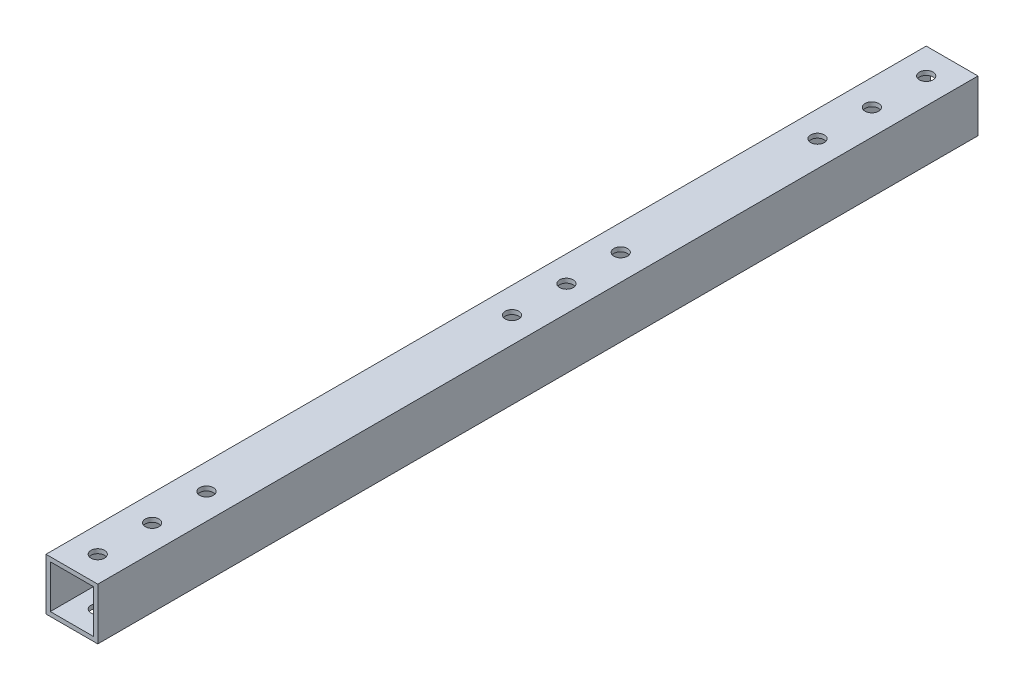
ISO-10303-21;
HEADER;
FILE_DESCRIPTION(('STEP AP214'),'2;1');
FILE_NAME('part.step','',(''),(''),'','','');
FILE_SCHEMA(('AUTOMOTIVE_DESIGN { 1 0 10303 214 1 1 1 1 }'));
ENDSEC;
DATA;
#1=APPLICATION_CONTEXT('core data for automotive mechanical design processes');
#2=APPLICATION_PROTOCOL_DEFINITION('international standard','automotive_design',2000,#1);
#3=PRODUCT_CONTEXT('',#1,'mechanical');
#4=PRODUCT('Part','Part','',(#3));
#5=PRODUCT_RELATED_PRODUCT_CATEGORY('part','',(#4));
#6=PRODUCT_DEFINITION_FORMATION('','',#4);
#7=PRODUCT_DEFINITION_CONTEXT('part definition',#1,'design');
#8=PRODUCT_DEFINITION('design','',#6,#7);
#9=PRODUCT_DEFINITION_SHAPE('','',#8);
#10=(LENGTH_UNIT() NAMED_UNIT(*) SI_UNIT(.MILLI.,.METRE.));
#11=(NAMED_UNIT(*) PLANE_ANGLE_UNIT() SI_UNIT($,.RADIAN.));
#12=(NAMED_UNIT(*) SI_UNIT($,.STERADIAN.) SOLID_ANGLE_UNIT());
#13=UNCERTAINTY_MEASURE_WITH_UNIT(LENGTH_MEASURE(1.E-05),#10,'distance_accuracy_value','');
#14=(GEOMETRIC_REPRESENTATION_CONTEXT(3) GLOBAL_UNCERTAINTY_ASSIGNED_CONTEXT((#13)) GLOBAL_UNIT_ASSIGNED_CONTEXT((#10,
#11,#12)) REPRESENTATION_CONTEXT('',''));
#15=CARTESIAN_POINT('',(0.,0.,0.));
#16=DIRECTION('',(0.,0.,1.));
#17=DIRECTION('',(1.,0.,0.));
#18=AXIS2_PLACEMENT_3D('',#15,#16,#17);
#19=CARTESIAN_POINT('',(0.,0.,161.925));
#20=DIRECTION('',(0.,0.,-1.));
#21=DIRECTION('',(-1.,0.,0.));
#22=AXIS2_PLACEMENT_3D('',#19,#20,#21);
#23=PLANE('',#22);
#24=DIRECTION('',(0.,1.,0.));
#25=VECTOR('',#24,1.);
#26=CARTESIAN_POINT('',(9.525,-9.525,161.925));
#27=LINE('',#26,#25);
#28=CARTESIAN_POINT('',(9.525,-9.525,161.925));
#29=VERTEX_POINT('',#28);
#30=CARTESIAN_POINT('',(9.525,9.525,161.925));
#31=VERTEX_POINT('',#30);
#32=EDGE_CURVE('E137',#29,#31,#27,.T.);
#33=ORIENTED_EDGE('',*,*,#32,.T.);
#34=DIRECTION('',(-1.,0.,0.));
#35=VECTOR('',#34,1.);
#36=CARTESIAN_POINT('',(-9.525,9.525,161.925));
#37=LINE('',#36,#35);
#38=CARTESIAN_POINT('',(-9.525,9.525,161.925));
#39=VERTEX_POINT('',#38);
#40=EDGE_CURVE('E140',#31,#39,#37,.T.);
#41=ORIENTED_EDGE('',*,*,#40,.T.);
#42=DIRECTION('',(0.,-1.,0.));
#43=VECTOR('',#42,1.);
#44=CARTESIAN_POINT('',(-9.525,-9.525,161.925));
#45=LINE('',#44,#43);
#46=CARTESIAN_POINT('',(-9.525,-9.525,161.925));
#47=VERTEX_POINT('',#46);
#48=EDGE_CURVE('E143',#39,#47,#45,.T.);
#49=ORIENTED_EDGE('',*,*,#48,.T.);
#50=DIRECTION('',(1.,0.,0.));
#51=VECTOR('',#50,1.);
#52=CARTESIAN_POINT('',(-9.525,-9.525,161.925));
#53=LINE('',#52,#51);
#54=EDGE_CURVE('E145',#47,#29,#53,.T.);
#55=ORIENTED_EDGE('',*,*,#54,.T.);
#56=EDGE_LOOP('',(#33,#41,#49,#55));
#57=FACE_BOUND('',#56,.T.);
#58=DIRECTION('',(0.,1.,0.));
#59=VECTOR('',#58,1.);
#60=CARTESIAN_POINT('',(7.9375,-7.9375,161.925));
#61=LINE('',#60,#59);
#62=CARTESIAN_POINT('',(7.9375,-7.9375,161.925));
#63=VERTEX_POINT('',#62);
#64=CARTESIAN_POINT('',(7.9375,7.9375,161.925));
#65=VERTEX_POINT('',#64);
#66=EDGE_CURVE('E99',#63,#65,#61,.T.);
#67=ORIENTED_EDGE('',*,*,#66,.F.);
#68=DIRECTION('',(1.,0.,0.));
#69=VECTOR('',#68,1.);
#70=CARTESIAN_POINT('',(-7.9375,-7.9375,161.925));
#71=LINE('',#70,#69);
#72=CARTESIAN_POINT('',(-7.9375,-7.9375,161.925));
#73=VERTEX_POINT('',#72);
#74=EDGE_CURVE('E121',#73,#63,#71,.T.);
#75=ORIENTED_EDGE('',*,*,#74,.F.);
#76=DIRECTION('',(0.,-1.,0.));
#77=VECTOR('',#76,1.);
#78=CARTESIAN_POINT('',(-7.9375,-7.9375,161.925));
#79=LINE('',#78,#77);
#80=CARTESIAN_POINT('',(-7.9375,7.9375,161.925));
#81=VERTEX_POINT('',#80);
#82=EDGE_CURVE('E119',#81,#73,#79,.T.);
#83=ORIENTED_EDGE('',*,*,#82,.F.);
#84=DIRECTION('',(-1.,0.,0.));
#85=VECTOR('',#84,1.);
#86=CARTESIAN_POINT('',(-7.9375,7.9375,161.925));
#87=LINE('',#86,#85);
#88=EDGE_CURVE('E107',#65,#81,#87,.T.);
#89=ORIENTED_EDGE('',*,*,#88,.F.);
#90=EDGE_LOOP('',(#67,#75,#83,#89));
#91=FACE_BOUND('',#90,.T.);
#92=ADVANCED_FACE('F32',(#57,#91),#23,.F.);
#93=CARTESIAN_POINT('',(0.,0.,-161.925));
#94=DIRECTION('',(0.,0.,-1.));
#95=DIRECTION('',(-1.,0.,0.));
#96=AXIS2_PLACEMENT_3D('',#93,#94,#95);
#97=PLANE('',#96);
#98=DIRECTION('',(0.,1.,0.));
#99=VECTOR('',#98,1.);
#100=CARTESIAN_POINT('',(9.525,-9.525,-161.925));
#101=LINE('',#100,#99);
#102=CARTESIAN_POINT('',(9.525,-9.525,-161.925));
#103=VERTEX_POINT('',#102);
#104=CARTESIAN_POINT('',(9.525,9.525,-161.925));
#105=VERTEX_POINT('',#104);
#106=EDGE_CURVE('E115',#103,#105,#101,.T.);
#107=ORIENTED_EDGE('',*,*,#106,.F.);
#108=DIRECTION('',(1.,0.,0.));
#109=VECTOR('',#108,1.);
#110=CARTESIAN_POINT('',(-9.525,-9.525,-161.925));
#111=LINE('',#110,#109);
#112=CARTESIAN_POINT('',(-9.525,-9.525,-161.925));
#113=VERTEX_POINT('',#112);
#114=EDGE_CURVE('E141',#113,#103,#111,.T.);
#115=ORIENTED_EDGE('',*,*,#114,.F.);
#116=DIRECTION('',(0.,-1.,0.));
#117=VECTOR('',#116,1.);
#118=CARTESIAN_POINT('',(-9.525,-9.525,-161.925));
#119=LINE('',#118,#117);
#120=CARTESIAN_POINT('',(-9.525,9.525,-161.925));
#121=VERTEX_POINT('',#120);
#122=EDGE_CURVE('E152',#121,#113,#119,.T.);
#123=ORIENTED_EDGE('',*,*,#122,.F.);
#124=DIRECTION('',(-1.,0.,0.));
#125=VECTOR('',#124,1.);
#126=CARTESIAN_POINT('',(-9.525,9.525,-161.925));
#127=LINE('',#126,#125);
#128=EDGE_CURVE('E150',#105,#121,#127,.T.);
#129=ORIENTED_EDGE('',*,*,#128,.F.);
#130=EDGE_LOOP('',(#107,#115,#123,#129));
#131=FACE_BOUND('',#130,.T.);
#132=DIRECTION('',(1.,0.,0.));
#133=VECTOR('',#132,1.);
#134=CARTESIAN_POINT('',(-7.9375,-7.9375,-161.925));
#135=LINE('',#134,#133);
#136=CARTESIAN_POINT('',(-7.9375,-7.9375,-161.925));
#137=VERTEX_POINT('',#136);
#138=CARTESIAN_POINT('',(7.9375,-7.9375,-161.925));
#139=VERTEX_POINT('',#138);
#140=EDGE_CURVE('E108',#137,#139,#135,.T.);
#141=ORIENTED_EDGE('',*,*,#140,.T.);
#142=DIRECTION('',(0.,1.,0.));
#143=VECTOR('',#142,1.);
#144=CARTESIAN_POINT('',(7.9375,-7.9375,-161.925));
#145=LINE('',#144,#143);
#146=CARTESIAN_POINT('',(7.9375,7.9375,-161.925));
#147=VERTEX_POINT('',#146);
#148=EDGE_CURVE('E57',#139,#147,#145,.T.);
#149=ORIENTED_EDGE('',*,*,#148,.T.);
#150=DIRECTION('',(-1.,0.,0.));
#151=VECTOR('',#150,1.);
#152=CARTESIAN_POINT('',(-7.9375,7.9375,-161.925));
#153=LINE('',#152,#151);
#154=CARTESIAN_POINT('',(-7.9375,7.9375,-161.925));
#155=VERTEX_POINT('',#154);
#156=EDGE_CURVE('E114',#147,#155,#153,.T.);
#157=ORIENTED_EDGE('',*,*,#156,.T.);
#158=DIRECTION('',(0.,-1.,0.));
#159=VECTOR('',#158,1.);
#160=CARTESIAN_POINT('',(-7.9375,-7.9375,-161.925));
#161=LINE('',#160,#159);
#162=EDGE_CURVE('E129',#155,#137,#161,.T.);
#163=ORIENTED_EDGE('',*,*,#162,.T.);
#164=EDGE_LOOP('',(#141,#149,#157,#163));
#165=FACE_BOUND('',#164,.T.);
#166=ADVANCED_FACE('F294',(#131,#165),#97,.T.);
#167=CARTESIAN_POINT('',(9.525,-9.525,161.925));
#168=DIRECTION('',(-1.,0.,0.));
#169=DIRECTION('',(0.,0.,1.));
#170=AXIS2_PLACEMENT_3D('',#167,#168,#169);
#171=PLANE('',#170);
#172=ORIENTED_EDGE('',*,*,#106,.T.);
#173=DIRECTION('',(0.,0.,-1.));
#174=VECTOR('',#173,1.);
#175=CARTESIAN_POINT('',(9.525,9.525,161.925));
#176=LINE('',#175,#174);
#177=EDGE_CURVE('E11',#31,#105,#176,.T.);
#178=ORIENTED_EDGE('',*,*,#177,.F.);
#179=ORIENTED_EDGE('',*,*,#32,.F.);
#180=DIRECTION('',(0.,0.,-1.));
#181=VECTOR('',#180,1.);
#182=CARTESIAN_POINT('',(9.525,-9.525,161.925));
#183=LINE('',#182,#181);
#184=EDGE_CURVE('E147',#29,#103,#183,.T.);
#185=ORIENTED_EDGE('',*,*,#184,.T.);
#186=EDGE_LOOP('',(#172,#178,#179,#185));
#187=FACE_BOUND('',#186,.T.);
#188=ADVANCED_FACE('F34',(#187),#171,.F.);
#189=CARTESIAN_POINT('',(-9.525,9.525,161.925));
#190=DIRECTION('',(0.,-1.,0.));
#191=DIRECTION('',(0.,0.,-1.));
#192=AXIS2_PLACEMENT_3D('',#189,#190,#191);
#193=PLANE('',#192);
#194=CARTESIAN_POINT('',(0.,9.525,-40.));
#195=DIRECTION('',(0.,-1.,0.));
#196=DIRECTION('',(0.,0.,-1.));
#197=AXIS2_PLACEMENT_3D('',#194,#195,#196);
#198=CIRCLE('',#197,2.50000000000002);
#199=CARTESIAN_POINT('',(0.,9.525,-42.5));
#200=VERTEX_POINT('',#199);
#201=EDGE_CURVE('E181',#200,#200,#198,.T.);
#202=ORIENTED_EDGE('',*,*,#201,.T.);
#203=EDGE_LOOP('',(#202));
#204=FACE_BOUND('',#203,.T.);
#205=CARTESIAN_POINT('',(0.,9.525,-20.));
#206=DIRECTION('',(0.,-1.,0.));
#207=DIRECTION('',(0.,0.,-1.));
#208=AXIS2_PLACEMENT_3D('',#205,#206,#207);
#209=CIRCLE('',#208,2.5);
#210=CARTESIAN_POINT('',(0.,9.525,-22.5));
#211=VERTEX_POINT('',#210);
#212=EDGE_CURVE('E215',#211,#211,#209,.T.);
#213=ORIENTED_EDGE('',*,*,#212,.T.);
#214=EDGE_LOOP('',(#213));
#215=FACE_BOUND('',#214,.T.);
#216=CARTESIAN_POINT('',(0.,9.525,0.));
#217=DIRECTION('',(0.,-1.,0.));
#218=DIRECTION('',(0.,0.,-1.));
#219=AXIS2_PLACEMENT_3D('',#216,#217,#218);
#220=CIRCLE('',#219,2.50000000000001);
#221=CARTESIAN_POINT('',(0.,9.525,-2.50000000000001));
#222=VERTEX_POINT('',#221);
#223=EDGE_CURVE('E198',#222,#222,#220,.T.);
#224=ORIENTED_EDGE('',*,*,#223,.T.);
#225=EDGE_LOOP('',(#224));
#226=FACE_BOUND('',#225,.T.);
#227=CARTESIAN_POINT('',(1.38777878078145E-13,9.525,112.4));
#228=DIRECTION('',(0.,-1.,0.));
#229=DIRECTION('',(0.,0.,-1.));
#230=AXIS2_PLACEMENT_3D('',#227,#228,#229);
#231=CIRCLE('',#230,2.5);
#232=CARTESIAN_POINT('',(1.38777878078145E-13,9.525,109.9));
#233=VERTEX_POINT('',#232);
#234=EDGE_CURVE('E166',#233,#233,#231,.F.);
#235=ORIENTED_EDGE('',*,*,#234,.F.);
#236=EDGE_LOOP('',(#235));
#237=FACE_BOUND('',#236,.T.);
#238=CARTESIAN_POINT('',(0.,9.525,132.4));
#239=DIRECTION('',(0.,-1.,0.));
#240=DIRECTION('',(0.,0.,-1.));
#241=AXIS2_PLACEMENT_3D('',#238,#239,#240);
#242=CIRCLE('',#241,2.5);
#243=CARTESIAN_POINT('',(0.,9.525,129.9));
#244=VERTEX_POINT('',#243);
#245=EDGE_CURVE('E191',#244,#244,#242,.F.);
#246=ORIENTED_EDGE('',*,*,#245,.F.);
#247=EDGE_LOOP('',(#246));
#248=FACE_BOUND('',#247,.T.);
#249=CARTESIAN_POINT('',(0.,9.525,152.4));
#250=DIRECTION('',(0.,-1.,0.));
#251=DIRECTION('',(0.,0.,-1.));
#252=AXIS2_PLACEMENT_3D('',#249,#250,#251);
#253=CIRCLE('',#252,2.50000000000002);
#254=CARTESIAN_POINT('',(0.,9.525,149.9));
#255=VERTEX_POINT('',#254);
#256=EDGE_CURVE('E186',#255,#255,#253,.F.);
#257=ORIENTED_EDGE('',*,*,#256,.F.);
#258=EDGE_LOOP('',(#257));
#259=FACE_BOUND('',#258,.T.);
#260=CARTESIAN_POINT('',(1.38777878078145E-13,9.525,-112.4));
#261=DIRECTION('',(0.,-1.,0.));
#262=DIRECTION('',(0.,0.,-1.));
#263=AXIS2_PLACEMENT_3D('',#260,#261,#262);
#264=CIRCLE('',#263,2.5);
#265=CARTESIAN_POINT('',(1.38777878078145E-13,9.525,-114.9));
#266=VERTEX_POINT('',#265);
#267=EDGE_CURVE('E127',#266,#266,#264,.T.);
#268=ORIENTED_EDGE('',*,*,#267,.T.);
#269=EDGE_LOOP('',(#268));
#270=FACE_BOUND('',#269,.T.);
#271=CARTESIAN_POINT('',(0.,9.525,-132.4));
#272=DIRECTION('',(0.,-1.,0.));
#273=DIRECTION('',(0.,0.,-1.));
#274=AXIS2_PLACEMENT_3D('',#271,#272,#273);
#275=CIRCLE('',#274,2.5);
#276=CARTESIAN_POINT('',(0.,9.525,-134.9));
#277=VERTEX_POINT('',#276);
#278=EDGE_CURVE('E176',#277,#277,#275,.T.);
#279=ORIENTED_EDGE('',*,*,#278,.T.);
#280=EDGE_LOOP('',(#279));
#281=FACE_BOUND('',#280,.T.);
#282=CARTESIAN_POINT('',(0.,9.525,-152.4));
#283=DIRECTION('',(0.,-1.,0.));
#284=DIRECTION('',(0.,0.,-1.));
#285=AXIS2_PLACEMENT_3D('',#282,#283,#284);
#286=CIRCLE('',#285,2.50000000000002);
#287=CARTESIAN_POINT('',(0.,9.525,-154.9));
#288=VERTEX_POINT('',#287);
#289=EDGE_CURVE('E171',#288,#288,#286,.T.);
#290=ORIENTED_EDGE('',*,*,#289,.T.);
#291=EDGE_LOOP('',(#290));
#292=FACE_BOUND('',#291,.T.);
#293=ORIENTED_EDGE('',*,*,#128,.T.);
#294=DIRECTION('',(0.,0.,-1.));
#295=VECTOR('',#294,1.);
#296=CARTESIAN_POINT('',(-9.525,9.525,161.925));
#297=LINE('',#296,#295);
#298=EDGE_CURVE('E41',#39,#121,#297,.T.);
#299=ORIENTED_EDGE('',*,*,#298,.F.);
#300=ORIENTED_EDGE('',*,*,#40,.F.);
#301=ORIENTED_EDGE('',*,*,#177,.T.);
#302=EDGE_LOOP('',(#293,#299,#300,#301));
#303=FACE_BOUND('',#302,.T.);
#304=ADVANCED_FACE('F268',(#204,#215,#226,#237,#248,#259,#270,#281,#292,#303),#193,.F.);
#305=CARTESIAN_POINT('',(-9.525,-9.525,161.925));
#306=DIRECTION('',(1.,0.,0.));
#307=DIRECTION('',(0.,0.,-1.));
#308=AXIS2_PLACEMENT_3D('',#305,#306,#307);
#309=PLANE('',#308);
#310=ORIENTED_EDGE('',*,*,#122,.T.);
#311=DIRECTION('',(0.,0.,-1.));
#312=VECTOR('',#311,1.);
#313=CARTESIAN_POINT('',(-9.525,-9.525,161.925));
#314=LINE('',#313,#312);
#315=EDGE_CURVE('E157',#47,#113,#314,.T.);
#316=ORIENTED_EDGE('',*,*,#315,.F.);
#317=ORIENTED_EDGE('',*,*,#48,.F.);
#318=ORIENTED_EDGE('',*,*,#298,.T.);
#319=EDGE_LOOP('',(#310,#316,#317,#318));
#320=FACE_BOUND('',#319,.T.);
#321=ADVANCED_FACE('F308',(#320),#309,.F.);
#322=CARTESIAN_POINT('',(-9.525,-9.525,161.925));
#323=DIRECTION('',(0.,1.,0.));
#324=DIRECTION('',(0.,0.,1.));
#325=AXIS2_PLACEMENT_3D('',#322,#323,#324);
#326=PLANE('',#325);
#327=CARTESIAN_POINT('',(0.,-9.525,-40.));
#328=DIRECTION('',(0.,1.,0.));
#329=DIRECTION('',(0.,0.,1.));
#330=AXIS2_PLACEMENT_3D('',#327,#328,#329);
#331=CIRCLE('',#330,2.50000000000002);
#332=CARTESIAN_POINT('',(0.,-9.525,-37.5));
#333=VERTEX_POINT('',#332);
#334=EDGE_CURVE('E221',#333,#333,#331,.T.);
#335=ORIENTED_EDGE('',*,*,#334,.T.);
#336=EDGE_LOOP('',(#335));
#337=FACE_BOUND('',#336,.T.);
#338=CARTESIAN_POINT('',(0.,-9.525,-20.));
#339=DIRECTION('',(0.,1.,0.));
#340=DIRECTION('',(0.,0.,1.));
#341=AXIS2_PLACEMENT_3D('',#338,#339,#340);
#342=CIRCLE('',#341,2.5);
#343=CARTESIAN_POINT('',(0.,-9.525,-17.5));
#344=VERTEX_POINT('',#343);
#345=EDGE_CURVE('E202',#344,#344,#342,.T.);
#346=ORIENTED_EDGE('',*,*,#345,.T.);
#347=EDGE_LOOP('',(#346));
#348=FACE_BOUND('',#347,.T.);
#349=CARTESIAN_POINT('',(0.,-9.525,0.));
#350=DIRECTION('',(0.,1.,0.));
#351=DIRECTION('',(0.,0.,1.));
#352=AXIS2_PLACEMENT_3D('',#349,#350,#351);
#353=CIRCLE('',#352,2.50000000000001);
#354=CARTESIAN_POINT('',(0.,-9.525,2.50000000000001));
#355=VERTEX_POINT('',#354);
#356=EDGE_CURVE('E205',#355,#355,#353,.T.);
#357=ORIENTED_EDGE('',*,*,#356,.T.);
#358=EDGE_LOOP('',(#357));
#359=FACE_BOUND('',#358,.T.);
#360=CARTESIAN_POINT('',(1.38777878078145E-13,-9.525,112.4));
#361=DIRECTION('',(0.,1.,0.));
#362=DIRECTION('',(0.,0.,1.));
#363=AXIS2_PLACEMENT_3D('',#360,#361,#362);
#364=CIRCLE('',#363,2.5);
#365=CARTESIAN_POINT('',(1.38777878078145E-13,-9.525,114.9));
#366=VERTEX_POINT('',#365);
#367=EDGE_CURVE('E242',#366,#366,#364,.F.);
#368=ORIENTED_EDGE('',*,*,#367,.F.);
#369=EDGE_LOOP('',(#368));
#370=FACE_BOUND('',#369,.T.);
#371=CARTESIAN_POINT('',(0.,-9.525,132.4));
#372=DIRECTION('',(0.,1.,0.));
#373=DIRECTION('',(0.,0.,1.));
#374=AXIS2_PLACEMENT_3D('',#371,#372,#373);
#375=CIRCLE('',#374,2.5);
#376=CARTESIAN_POINT('',(0.,-9.525,134.9));
#377=VERTEX_POINT('',#376);
#378=EDGE_CURVE('E235',#377,#377,#375,.F.);
#379=ORIENTED_EDGE('',*,*,#378,.F.);
#380=EDGE_LOOP('',(#379));
#381=FACE_BOUND('',#380,.T.);
#382=CARTESIAN_POINT('',(0.,-9.525,152.4));
#383=DIRECTION('',(0.,1.,0.));
#384=DIRECTION('',(0.,0.,1.));
#385=AXIS2_PLACEMENT_3D('',#382,#383,#384);
#386=CIRCLE('',#385,2.50000000000002);
#387=CARTESIAN_POINT('',(0.,-9.525,154.9));
#388=VERTEX_POINT('',#387);
#389=EDGE_CURVE('E228',#388,#388,#386,.F.);
#390=ORIENTED_EDGE('',*,*,#389,.F.);
#391=EDGE_LOOP('',(#390));
#392=FACE_BOUND('',#391,.T.);
#393=CARTESIAN_POINT('',(1.38777878078145E-13,-9.525,-112.4));
#394=DIRECTION('',(0.,1.,0.));
#395=DIRECTION('',(0.,0.,1.));
#396=AXIS2_PLACEMENT_3D('',#393,#394,#395);
#397=CIRCLE('',#396,2.5);
#398=CARTESIAN_POINT('',(1.38777878078145E-13,-9.525,-109.9));
#399=VERTEX_POINT('',#398);
#400=EDGE_CURVE('E263',#399,#399,#397,.T.);
#401=ORIENTED_EDGE('',*,*,#400,.T.);
#402=EDGE_LOOP('',(#401));
#403=FACE_BOUND('',#402,.T.);
#404=CARTESIAN_POINT('',(0.,-9.525,-132.4));
#405=DIRECTION('',(0.,1.,0.));
#406=DIRECTION('',(0.,0.,1.));
#407=AXIS2_PLACEMENT_3D('',#404,#405,#406);
#408=CIRCLE('',#407,2.5);
#409=CARTESIAN_POINT('',(0.,-9.525,-129.9));
#410=VERTEX_POINT('',#409);
#411=EDGE_CURVE('E256',#410,#410,#408,.T.);
#412=ORIENTED_EDGE('',*,*,#411,.T.);
#413=EDGE_LOOP('',(#412));
#414=FACE_BOUND('',#413,.T.);
#415=CARTESIAN_POINT('',(0.,-9.525,-152.4));
#416=DIRECTION('',(0.,1.,0.));
#417=DIRECTION('',(0.,0.,1.));
#418=AXIS2_PLACEMENT_3D('',#415,#416,#417);
#419=CIRCLE('',#418,2.50000000000002);
#420=CARTESIAN_POINT('',(0.,-9.525,-149.9));
#421=VERTEX_POINT('',#420);
#422=EDGE_CURVE('E249',#421,#421,#419,.T.);
#423=ORIENTED_EDGE('',*,*,#422,.T.);
#424=EDGE_LOOP('',(#423));
#425=FACE_BOUND('',#424,.T.);
#426=ORIENTED_EDGE('',*,*,#114,.T.);
#427=ORIENTED_EDGE('',*,*,#184,.F.);
#428=ORIENTED_EDGE('',*,*,#54,.F.);
#429=ORIENTED_EDGE('',*,*,#315,.T.);
#430=EDGE_LOOP('',(#426,#427,#428,#429));
#431=FACE_BOUND('',#430,.T.);
#432=ADVANCED_FACE('F305',(#337,#348,#359,#370,#381,#392,#403,#414,#425,#431),#326,.F.);
#433=CARTESIAN_POINT('',(7.9375,-7.9375,161.925));
#434=DIRECTION('',(-1.,0.,0.));
#435=DIRECTION('',(0.,-1.,0.));
#436=AXIS2_PLACEMENT_3D('',#433,#434,#435);
#437=PLANE('',#436);
#438=ORIENTED_EDGE('',*,*,#148,.F.);
#439=DIRECTION('',(0.,0.,-1.));
#440=VECTOR('',#439,1.);
#441=CARTESIAN_POINT('',(7.9375,-7.9375,161.925));
#442=LINE('',#441,#440);
#443=EDGE_CURVE('E103',#63,#139,#442,.T.);
#444=ORIENTED_EDGE('',*,*,#443,.F.);
#445=ORIENTED_EDGE('',*,*,#66,.T.);
#446=DIRECTION('',(0.,0.,-1.));
#447=VECTOR('',#446,1.);
#448=CARTESIAN_POINT('',(7.9375,7.9375,161.925));
#449=LINE('',#448,#447);
#450=EDGE_CURVE('E102',#65,#147,#449,.T.);
#451=ORIENTED_EDGE('',*,*,#450,.T.);
#452=EDGE_LOOP('',(#438,#444,#445,#451));
#453=FACE_BOUND('',#452,.T.);
#454=ADVANCED_FACE('F101',(#453),#437,.T.);
#455=CARTESIAN_POINT('',(-7.9375,7.9375,161.925));
#456=DIRECTION('',(0.,-1.,0.));
#457=DIRECTION('',(0.,0.,-1.));
#458=AXIS2_PLACEMENT_3D('',#455,#456,#457);
#459=PLANE('',#458);
#460=CARTESIAN_POINT('',(0.,7.9375,-40.));
#461=DIRECTION('',(0.,-1.,0.));
#462=DIRECTION('',(0.,0.,-1.));
#463=AXIS2_PLACEMENT_3D('',#460,#461,#462);
#464=CIRCLE('',#463,2.50000000000002);
#465=CARTESIAN_POINT('',(0.,7.9375,-42.5));
#466=VERTEX_POINT('',#465);
#467=EDGE_CURVE('E218',#466,#466,#464,.T.);
#468=ORIENTED_EDGE('',*,*,#467,.F.);
#469=EDGE_LOOP('',(#468));
#470=FACE_BOUND('',#469,.T.);
#471=CARTESIAN_POINT('',(0.,7.9375,-20.));
#472=DIRECTION('',(0.,-1.,0.));
#473=DIRECTION('',(0.,0.,-1.));
#474=AXIS2_PLACEMENT_3D('',#471,#472,#473);
#475=CIRCLE('',#474,2.5);
#476=CARTESIAN_POINT('',(0.,7.9375,-22.5));
#477=VERTEX_POINT('',#476);
#478=EDGE_CURVE('E197',#477,#477,#475,.T.);
#479=ORIENTED_EDGE('',*,*,#478,.F.);
#480=EDGE_LOOP('',(#479));
#481=FACE_BOUND('',#480,.T.);
#482=CARTESIAN_POINT('',(0.,7.9375,0.));
#483=DIRECTION('',(0.,-1.,0.));
#484=DIRECTION('',(0.,0.,-1.));
#485=AXIS2_PLACEMENT_3D('',#482,#483,#484);
#486=CIRCLE('',#485,2.50000000000001);
#487=CARTESIAN_POINT('',(0.,7.9375,-2.50000000000001));
#488=VERTEX_POINT('',#487);
#489=EDGE_CURVE('E194',#488,#488,#486,.T.);
#490=ORIENTED_EDGE('',*,*,#489,.F.);
#491=EDGE_LOOP('',(#490));
#492=FACE_BOUND('',#491,.T.);
#493=CARTESIAN_POINT('',(1.38777878078145E-13,7.9375,112.4));
#494=DIRECTION('',(0.,-1.,0.));
#495=DIRECTION('',(0.,0.,-1.));
#496=AXIS2_PLACEMENT_3D('',#493,#494,#495);
#497=CIRCLE('',#496,2.5);
#498=CARTESIAN_POINT('',(1.38777878078145E-13,7.9375,109.9));
#499=VERTEX_POINT('',#498);
#500=EDGE_CURVE('E190',#499,#499,#497,.F.);
#501=ORIENTED_EDGE('',*,*,#500,.T.);
#502=EDGE_LOOP('',(#501));
#503=FACE_BOUND('',#502,.T.);
#504=CARTESIAN_POINT('',(0.,7.9375,132.4));
#505=DIRECTION('',(0.,-1.,0.));
#506=DIRECTION('',(0.,0.,-1.));
#507=AXIS2_PLACEMENT_3D('',#504,#505,#506);
#508=CIRCLE('',#507,2.5);
#509=CARTESIAN_POINT('',(0.,7.9375,129.9));
#510=VERTEX_POINT('',#509);
#511=EDGE_CURVE('E185',#510,#510,#508,.F.);
#512=ORIENTED_EDGE('',*,*,#511,.T.);
#513=EDGE_LOOP('',(#512));
#514=FACE_BOUND('',#513,.T.);
#515=CARTESIAN_POINT('',(0.,7.9375,152.4));
#516=DIRECTION('',(0.,-1.,0.));
#517=DIRECTION('',(0.,0.,-1.));
#518=AXIS2_PLACEMENT_3D('',#515,#516,#517);
#519=CIRCLE('',#518,2.50000000000002);
#520=CARTESIAN_POINT('',(0.,7.9375,149.9));
#521=VERTEX_POINT('',#520);
#522=EDGE_CURVE('E180',#521,#521,#519,.F.);
#523=ORIENTED_EDGE('',*,*,#522,.T.);
#524=EDGE_LOOP('',(#523));
#525=FACE_BOUND('',#524,.T.);
#526=CARTESIAN_POINT('',(1.38777878078145E-13,7.9375,-112.4));
#527=DIRECTION('',(0.,-1.,0.));
#528=DIRECTION('',(0.,0.,-1.));
#529=AXIS2_PLACEMENT_3D('',#526,#527,#528);
#530=CIRCLE('',#529,2.5);
#531=CARTESIAN_POINT('',(1.38777878078145E-13,7.9375,-114.9));
#532=VERTEX_POINT('',#531);
#533=EDGE_CURVE('E175',#532,#532,#530,.T.);
#534=ORIENTED_EDGE('',*,*,#533,.F.);
#535=EDGE_LOOP('',(#534));
#536=FACE_BOUND('',#535,.T.);
#537=CARTESIAN_POINT('',(0.,7.9375,-132.4));
#538=DIRECTION('',(0.,-1.,0.));
#539=DIRECTION('',(0.,0.,-1.));
#540=AXIS2_PLACEMENT_3D('',#537,#538,#539);
#541=CIRCLE('',#540,2.5);
#542=CARTESIAN_POINT('',(0.,7.9375,-134.9));
#543=VERTEX_POINT('',#542);
#544=EDGE_CURVE('E170',#543,#543,#541,.T.);
#545=ORIENTED_EDGE('',*,*,#544,.F.);
#546=EDGE_LOOP('',(#545));
#547=FACE_BOUND('',#546,.T.);
#548=CARTESIAN_POINT('',(0.,7.9375,-152.4));
#549=DIRECTION('',(0.,-1.,0.));
#550=DIRECTION('',(0.,0.,-1.));
#551=AXIS2_PLACEMENT_3D('',#548,#549,#550);
#552=CIRCLE('',#551,2.50000000000002);
#553=CARTESIAN_POINT('',(0.,7.9375,-154.9));
#554=VERTEX_POINT('',#553);
#555=EDGE_CURVE('E165',#554,#554,#552,.T.);
#556=ORIENTED_EDGE('',*,*,#555,.F.);
#557=EDGE_LOOP('',(#556));
#558=FACE_BOUND('',#557,.T.);
#559=ORIENTED_EDGE('',*,*,#156,.F.);
#560=ORIENTED_EDGE('',*,*,#450,.F.);
#561=ORIENTED_EDGE('',*,*,#88,.T.);
#562=DIRECTION('',(0.,0.,-1.));
#563=VECTOR('',#562,1.);
#564=CARTESIAN_POINT('',(-7.9375,7.9375,161.925));
#565=LINE('',#564,#563);
#566=EDGE_CURVE('E116',#81,#155,#565,.T.);
#567=ORIENTED_EDGE('',*,*,#566,.T.);
#568=EDGE_LOOP('',(#559,#560,#561,#567));
#569=FACE_BOUND('',#568,.T.);
#570=ADVANCED_FACE('F111',(#470,#481,#492,#503,#514,#525,#536,#547,#558,#569),#459,.T.);
#571=CARTESIAN_POINT('',(-7.9375,-7.9375,161.925));
#572=DIRECTION('',(1.,0.,0.));
#573=DIRECTION('',(0.,0.,-1.));
#574=AXIS2_PLACEMENT_3D('',#571,#572,#573);
#575=PLANE('',#574);
#576=ORIENTED_EDGE('',*,*,#162,.F.);
#577=ORIENTED_EDGE('',*,*,#566,.F.);
#578=ORIENTED_EDGE('',*,*,#82,.T.);
#579=DIRECTION('',(0.,0.,-1.));
#580=VECTOR('',#579,1.);
#581=CARTESIAN_POINT('',(-7.9375,-7.9375,161.925));
#582=LINE('',#581,#580);
#583=EDGE_CURVE('E49',#73,#137,#582,.T.);
#584=ORIENTED_EDGE('',*,*,#583,.T.);
#585=EDGE_LOOP('',(#576,#577,#578,#584));
#586=FACE_BOUND('',#585,.T.);
#587=ADVANCED_FACE('F404',(#586),#575,.T.);
#588=CARTESIAN_POINT('',(-7.9375,-7.9375,161.925));
#589=DIRECTION('',(0.,1.,0.));
#590=DIRECTION('',(0.,0.,1.));
#591=AXIS2_PLACEMENT_3D('',#588,#589,#590);
#592=PLANE('',#591);
#593=CARTESIAN_POINT('',(0.,-7.9375,-40.));
#594=DIRECTION('',(0.,1.,0.));
#595=DIRECTION('',(0.,0.,1.));
#596=AXIS2_PLACEMENT_3D('',#593,#594,#595);
#597=CIRCLE('',#596,2.50000000000002);
#598=CARTESIAN_POINT('',(0.,-7.9375,-37.5));
#599=VERTEX_POINT('',#598);
#600=EDGE_CURVE('E36',#599,#599,#597,.T.);
#601=ORIENTED_EDGE('',*,*,#600,.F.);
#602=EDGE_LOOP('',(#601));
#603=FACE_BOUND('',#602,.T.);
#604=CARTESIAN_POINT('',(0.,-7.9375,-20.));
#605=DIRECTION('',(0.,1.,0.));
#606=DIRECTION('',(0.,0.,1.));
#607=AXIS2_PLACEMENT_3D('',#604,#605,#606);
#608=CIRCLE('',#607,2.5);
#609=CARTESIAN_POINT('',(0.,-7.9375,-17.5));
#610=VERTEX_POINT('',#609);
#611=EDGE_CURVE('E195',#610,#610,#608,.T.);
#612=ORIENTED_EDGE('',*,*,#611,.F.);
#613=EDGE_LOOP('',(#612));
#614=FACE_BOUND('',#613,.T.);
#615=CARTESIAN_POINT('',(0.,-7.9375,0.));
#616=DIRECTION('',(0.,1.,0.));
#617=DIRECTION('',(0.,0.,1.));
#618=AXIS2_PLACEMENT_3D('',#615,#616,#617);
#619=CIRCLE('',#618,2.50000000000001);
#620=CARTESIAN_POINT('',(0.,-7.9375,2.50000000000001));
#621=VERTEX_POINT('',#620);
#622=EDGE_CURVE('E192',#621,#621,#619,.T.);
#623=ORIENTED_EDGE('',*,*,#622,.F.);
#624=EDGE_LOOP('',(#623));
#625=FACE_BOUND('',#624,.T.);
#626=CARTESIAN_POINT('',(1.38777878078145E-13,-7.9375,112.4));
#627=DIRECTION('',(0.,1.,0.));
#628=DIRECTION('',(0.,0.,1.));
#629=AXIS2_PLACEMENT_3D('',#626,#627,#628);
#630=CIRCLE('',#629,2.5);
#631=CARTESIAN_POINT('',(1.38777878078145E-13,-7.9375,114.9));
#632=VERTEX_POINT('',#631);
#633=EDGE_CURVE('E187',#632,#632,#630,.F.);
#634=ORIENTED_EDGE('',*,*,#633,.T.);
#635=EDGE_LOOP('',(#634));
#636=FACE_BOUND('',#635,.T.);
#637=CARTESIAN_POINT('',(0.,-7.9375,132.4));
#638=DIRECTION('',(0.,1.,0.));
#639=DIRECTION('',(0.,0.,1.));
#640=AXIS2_PLACEMENT_3D('',#637,#638,#639);
#641=CIRCLE('',#640,2.5);
#642=CARTESIAN_POINT('',(0.,-7.9375,134.9));
#643=VERTEX_POINT('',#642);
#644=EDGE_CURVE('E182',#643,#643,#641,.F.);
#645=ORIENTED_EDGE('',*,*,#644,.T.);
#646=EDGE_LOOP('',(#645));
#647=FACE_BOUND('',#646,.T.);
#648=CARTESIAN_POINT('',(0.,-7.9375,152.4));
#649=DIRECTION('',(0.,1.,0.));
#650=DIRECTION('',(0.,0.,1.));
#651=AXIS2_PLACEMENT_3D('',#648,#649,#650);
#652=CIRCLE('',#651,2.50000000000002);
#653=CARTESIAN_POINT('',(0.,-7.9375,154.9));
#654=VERTEX_POINT('',#653);
#655=EDGE_CURVE('E177',#654,#654,#652,.F.);
#656=ORIENTED_EDGE('',*,*,#655,.T.);
#657=EDGE_LOOP('',(#656));
#658=FACE_BOUND('',#657,.T.);
#659=CARTESIAN_POINT('',(1.38777878078145E-13,-7.9375,-112.4));
#660=DIRECTION('',(0.,1.,0.));
#661=DIRECTION('',(0.,0.,1.));
#662=AXIS2_PLACEMENT_3D('',#659,#660,#661);
#663=CIRCLE('',#662,2.5);
#664=CARTESIAN_POINT('',(1.38777878078145E-13,-7.9375,-109.9));
#665=VERTEX_POINT('',#664);
#666=EDGE_CURVE('E172',#665,#665,#663,.T.);
#667=ORIENTED_EDGE('',*,*,#666,.F.);
#668=EDGE_LOOP('',(#667));
#669=FACE_BOUND('',#668,.T.);
#670=CARTESIAN_POINT('',(0.,-7.9375,-132.4));
#671=DIRECTION('',(0.,1.,0.));
#672=DIRECTION('',(0.,0.,1.));
#673=AXIS2_PLACEMENT_3D('',#670,#671,#672);
#674=CIRCLE('',#673,2.5);
#675=CARTESIAN_POINT('',(0.,-7.9375,-129.9));
#676=VERTEX_POINT('',#675);
#677=EDGE_CURVE('E167',#676,#676,#674,.T.);
#678=ORIENTED_EDGE('',*,*,#677,.F.);
#679=EDGE_LOOP('',(#678));
#680=FACE_BOUND('',#679,.T.);
#681=CARTESIAN_POINT('',(0.,-7.9375,-152.4));
#682=DIRECTION('',(0.,1.,0.));
#683=DIRECTION('',(0.,0.,1.));
#684=AXIS2_PLACEMENT_3D('',#681,#682,#683);
#685=CIRCLE('',#684,2.50000000000002);
#686=CARTESIAN_POINT('',(0.,-7.9375,-149.9));
#687=VERTEX_POINT('',#686);
#688=EDGE_CURVE('E162',#687,#687,#685,.T.);
#689=ORIENTED_EDGE('',*,*,#688,.F.);
#690=EDGE_LOOP('',(#689));
#691=FACE_BOUND('',#690,.T.);
#692=ORIENTED_EDGE('',*,*,#140,.F.);
#693=ORIENTED_EDGE('',*,*,#583,.F.);
#694=ORIENTED_EDGE('',*,*,#74,.T.);
#695=ORIENTED_EDGE('',*,*,#443,.T.);
#696=EDGE_LOOP('',(#692,#693,#694,#695));
#697=FACE_BOUND('',#696,.T.);
#698=ADVANCED_FACE('F401',(#603,#614,#625,#636,#647,#658,#669,#680,#691,#697),#592,.T.);
#699=CARTESIAN_POINT('',(0.,-16.475,-152.4));
#700=DIRECTION('',(0.,1.,0.));
#701=DIRECTION('',(0.,0.,1.));
#702=AXIS2_PLACEMENT_3D('',#699,#700,#701);
#703=CYLINDRICAL_SURFACE('',#702,2.50000000000002);
#704=ORIENTED_EDGE('',*,*,#688,.T.);
#705=EDGE_LOOP('',(#704));
#706=FACE_BOUND('',#705,.T.);
#707=ORIENTED_EDGE('',*,*,#422,.F.);
#708=EDGE_LOOP('',(#707));
#709=FACE_BOUND('',#708,.T.);
#710=ADVANCED_FACE('F403',(#706,#709),#703,.F.);
#711=CARTESIAN_POINT('',(0.,-16.475,-132.4));
#712=DIRECTION('',(0.,1.,0.));
#713=DIRECTION('',(0.,0.,1.));
#714=AXIS2_PLACEMENT_3D('',#711,#712,#713);
#715=CYLINDRICAL_SURFACE('',#714,2.5);
#716=ORIENTED_EDGE('',*,*,#677,.T.);
#717=EDGE_LOOP('',(#716));
#718=FACE_BOUND('',#717,.T.);
#719=ORIENTED_EDGE('',*,*,#411,.F.);
#720=EDGE_LOOP('',(#719));
#721=FACE_BOUND('',#720,.T.);
#722=ADVANCED_FACE('F289',(#718,#721),#715,.F.);
#723=CARTESIAN_POINT('',(1.38777878078145E-13,-16.475,-112.4));
#724=DIRECTION('',(0.,1.,0.));
#725=DIRECTION('',(0.,0.,1.));
#726=AXIS2_PLACEMENT_3D('',#723,#724,#725);
#727=CYLINDRICAL_SURFACE('',#726,2.5);
#728=ORIENTED_EDGE('',*,*,#666,.T.);
#729=EDGE_LOOP('',(#728));
#730=FACE_BOUND('',#729,.T.);
#731=ORIENTED_EDGE('',*,*,#400,.F.);
#732=EDGE_LOOP('',(#731));
#733=FACE_BOUND('',#732,.T.);
#734=ADVANCED_FACE('F277',(#730,#733),#727,.F.);
#735=ORIENTED_EDGE('',*,*,#555,.T.);
#736=EDGE_LOOP('',(#735));
#737=FACE_BOUND('',#736,.T.);
#738=ORIENTED_EDGE('',*,*,#289,.F.);
#739=EDGE_LOOP('',(#738));
#740=FACE_BOUND('',#739,.T.);
#741=ADVANCED_FACE('F286',(#737,#740),#703,.F.);
#742=ORIENTED_EDGE('',*,*,#544,.T.);
#743=EDGE_LOOP('',(#742));
#744=FACE_BOUND('',#743,.T.);
#745=ORIENTED_EDGE('',*,*,#278,.F.);
#746=EDGE_LOOP('',(#745));
#747=FACE_BOUND('',#746,.T.);
#748=ADVANCED_FACE('F274',(#744,#747),#715,.F.);
#749=ORIENTED_EDGE('',*,*,#533,.T.);
#750=EDGE_LOOP('',(#749));
#751=FACE_BOUND('',#750,.T.);
#752=ORIENTED_EDGE('',*,*,#267,.F.);
#753=EDGE_LOOP('',(#752));
#754=FACE_BOUND('',#753,.T.);
#755=ADVANCED_FACE('F271',(#751,#754),#727,.F.);
#756=CARTESIAN_POINT('',(0.,-16.475,152.4));
#757=DIRECTION('',(0.,1.,0.));
#758=DIRECTION('',(0.,0.,1.));
#759=AXIS2_PLACEMENT_3D('',#756,#757,#758);
#760=CYLINDRICAL_SURFACE('',#759,2.50000000000002);
#761=ORIENTED_EDGE('',*,*,#655,.F.);
#762=EDGE_LOOP('',(#761));
#763=FACE_BOUND('',#762,.T.);
#764=ORIENTED_EDGE('',*,*,#389,.T.);
#765=EDGE_LOOP('',(#764));
#766=FACE_BOUND('',#765,.T.);
#767=ADVANCED_FACE('F273',(#763,#766),#760,.F.);
#768=CARTESIAN_POINT('',(0.,-16.475,132.4));
#769=DIRECTION('',(0.,1.,0.));
#770=DIRECTION('',(0.,0.,1.));
#771=AXIS2_PLACEMENT_3D('',#768,#769,#770);
#772=CYLINDRICAL_SURFACE('',#771,2.5);
#773=ORIENTED_EDGE('',*,*,#644,.F.);
#774=EDGE_LOOP('',(#773));
#775=FACE_BOUND('',#774,.T.);
#776=ORIENTED_EDGE('',*,*,#378,.T.);
#777=EDGE_LOOP('',(#776));
#778=FACE_BOUND('',#777,.T.);
#779=ADVANCED_FACE('F282',(#775,#778),#772,.F.);
#780=CARTESIAN_POINT('',(1.38777878078145E-13,-16.475,112.4));
#781=DIRECTION('',(0.,1.,0.));
#782=DIRECTION('',(0.,0.,1.));
#783=AXIS2_PLACEMENT_3D('',#780,#781,#782);
#784=CYLINDRICAL_SURFACE('',#783,2.5);
#785=ORIENTED_EDGE('',*,*,#633,.F.);
#786=EDGE_LOOP('',(#785));
#787=FACE_BOUND('',#786,.T.);
#788=ORIENTED_EDGE('',*,*,#367,.T.);
#789=EDGE_LOOP('',(#788));
#790=FACE_BOUND('',#789,.T.);
#791=ADVANCED_FACE('F331',(#787,#790),#784,.F.);
#792=ORIENTED_EDGE('',*,*,#522,.F.);
#793=EDGE_LOOP('',(#792));
#794=FACE_BOUND('',#793,.T.);
#795=ORIENTED_EDGE('',*,*,#256,.T.);
#796=EDGE_LOOP('',(#795));
#797=FACE_BOUND('',#796,.T.);
#798=ADVANCED_FACE('F285',(#794,#797),#760,.F.);
#799=ORIENTED_EDGE('',*,*,#511,.F.);
#800=EDGE_LOOP('',(#799));
#801=FACE_BOUND('',#800,.T.);
#802=ORIENTED_EDGE('',*,*,#245,.T.);
#803=EDGE_LOOP('',(#802));
#804=FACE_BOUND('',#803,.T.);
#805=ADVANCED_FACE('F330',(#801,#804),#772,.F.);
#806=ORIENTED_EDGE('',*,*,#500,.F.);
#807=EDGE_LOOP('',(#806));
#808=FACE_BOUND('',#807,.T.);
#809=ORIENTED_EDGE('',*,*,#234,.T.);
#810=EDGE_LOOP('',(#809));
#811=FACE_BOUND('',#810,.T.);
#812=ADVANCED_FACE('F337',(#808,#811),#784,.F.);
#813=CARTESIAN_POINT('',(0.,-16.475,0.));
#814=DIRECTION('',(0.,1.,0.));
#815=DIRECTION('',(0.,0.,1.));
#816=AXIS2_PLACEMENT_3D('',#813,#814,#815);
#817=CYLINDRICAL_SURFACE('',#816,2.50000000000001);
#818=ORIENTED_EDGE('',*,*,#622,.T.);
#819=EDGE_LOOP('',(#818));
#820=FACE_BOUND('',#819,.T.);
#821=ORIENTED_EDGE('',*,*,#356,.F.);
#822=EDGE_LOOP('',(#821));
#823=FACE_BOUND('',#822,.T.);
#824=ADVANCED_FACE('F344',(#820,#823),#817,.F.);
#825=CARTESIAN_POINT('',(0.,-16.475,-20.));
#826=DIRECTION('',(0.,1.,0.));
#827=DIRECTION('',(0.,0.,1.));
#828=AXIS2_PLACEMENT_3D('',#825,#826,#827);
#829=CYLINDRICAL_SURFACE('',#828,2.5);
#830=ORIENTED_EDGE('',*,*,#611,.T.);
#831=EDGE_LOOP('',(#830));
#832=FACE_BOUND('',#831,.T.);
#833=ORIENTED_EDGE('',*,*,#345,.F.);
#834=EDGE_LOOP('',(#833));
#835=FACE_BOUND('',#834,.T.);
#836=ADVANCED_FACE('F359',(#832,#835),#829,.F.);
#837=CARTESIAN_POINT('',(0.,-16.475,-40.));
#838=DIRECTION('',(0.,1.,0.));
#839=DIRECTION('',(0.,0.,1.));
#840=AXIS2_PLACEMENT_3D('',#837,#838,#839);
#841=CYLINDRICAL_SURFACE('',#840,2.50000000000002);
#842=ORIENTED_EDGE('',*,*,#600,.T.);
#843=EDGE_LOOP('',(#842));
#844=FACE_BOUND('',#843,.T.);
#845=ORIENTED_EDGE('',*,*,#334,.F.);
#846=EDGE_LOOP('',(#845));
#847=FACE_BOUND('',#846,.T.);
#848=ADVANCED_FACE('F351',(#844,#847),#841,.F.);
#849=ORIENTED_EDGE('',*,*,#489,.T.);
#850=EDGE_LOOP('',(#849));
#851=FACE_BOUND('',#850,.T.);
#852=ORIENTED_EDGE('',*,*,#223,.F.);
#853=EDGE_LOOP('',(#852));
#854=FACE_BOUND('',#853,.T.);
#855=ADVANCED_FACE('F347',(#851,#854),#817,.F.);
#856=ORIENTED_EDGE('',*,*,#478,.T.);
#857=EDGE_LOOP('',(#856));
#858=FACE_BOUND('',#857,.T.);
#859=ORIENTED_EDGE('',*,*,#212,.F.);
#860=EDGE_LOOP('',(#859));
#861=FACE_BOUND('',#860,.T.);
#862=ADVANCED_FACE('F350',(#858,#861),#829,.F.);
#863=ORIENTED_EDGE('',*,*,#467,.T.);
#864=EDGE_LOOP('',(#863));
#865=FACE_BOUND('',#864,.T.);
#866=ORIENTED_EDGE('',*,*,#201,.F.);
#867=EDGE_LOOP('',(#866));
#868=FACE_BOUND('',#867,.T.);
#869=ADVANCED_FACE('F353',(#865,#868),#841,.F.);
#870=CLOSED_SHELL('',(#92,#166,#188,#304,#321,#432,#454,#570,#587,#698,#710,#722,#734,#741,#748,
#755,#767,#779,#791,#798,#805,#812,#824,#836,#848,#855,#862,#869));
#871=MANIFOLD_SOLID_BREP('B2',#870);
#872=ADVANCED_BREP_SHAPE_REPRESENTATION('',(#18,#871),#14);
#873=SHAPE_DEFINITION_REPRESENTATION(#9,#872);
ENDSEC;
END-ISO-10303-21;
